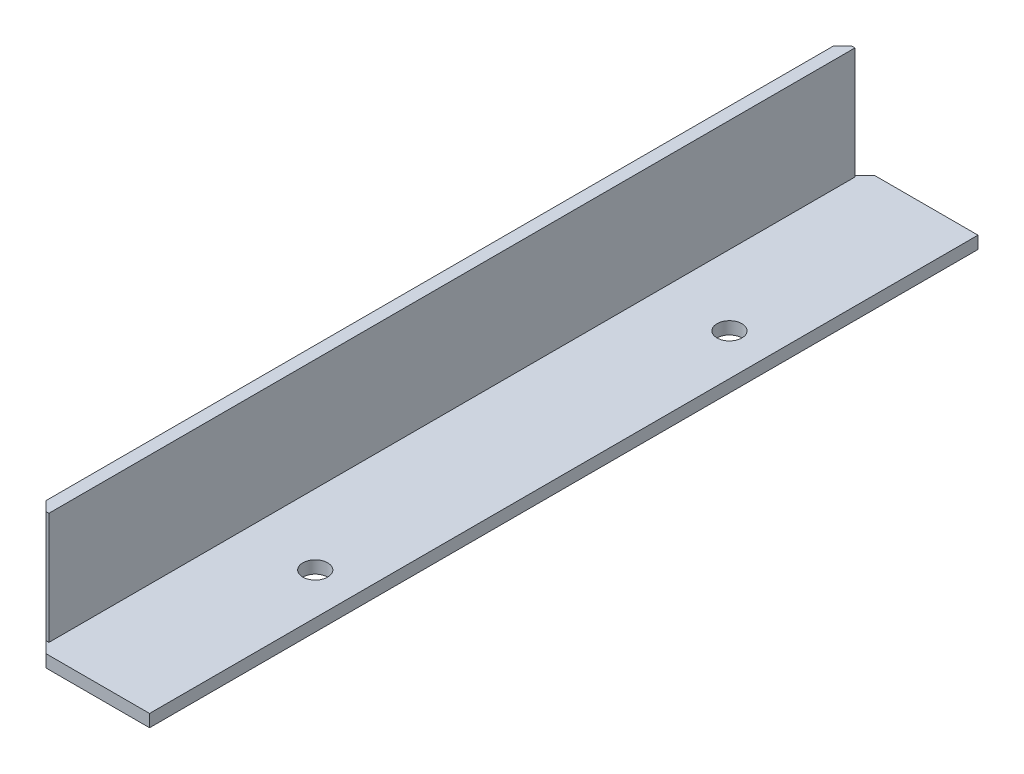
ISO-10303-21;
HEADER;
FILE_DESCRIPTION(('STEP AP214'),'2;1');
FILE_NAME('part.step','',(''),(''),'','','');
FILE_SCHEMA(('AUTOMOTIVE_DESIGN { 1 0 10303 214 1 1 1 1 }'));
ENDSEC;
DATA;
#1=APPLICATION_CONTEXT('core data for automotive mechanical design processes');
#2=APPLICATION_PROTOCOL_DEFINITION('international standard','automotive_design',2000,#1);
#3=PRODUCT_CONTEXT('',#1,'mechanical');
#4=PRODUCT('Part','Part','',(#3));
#5=PRODUCT_RELATED_PRODUCT_CATEGORY('part','',(#4));
#6=PRODUCT_DEFINITION_FORMATION('','',#4);
#7=PRODUCT_DEFINITION_CONTEXT('part definition',#1,'design');
#8=PRODUCT_DEFINITION('design','',#6,#7);
#9=PRODUCT_DEFINITION_SHAPE('','',#8);
#10=(LENGTH_UNIT() NAMED_UNIT(*) SI_UNIT(.MILLI.,.METRE.));
#11=(NAMED_UNIT(*) PLANE_ANGLE_UNIT() SI_UNIT($,.RADIAN.));
#12=(NAMED_UNIT(*) SI_UNIT($,.STERADIAN.) SOLID_ANGLE_UNIT());
#13=UNCERTAINTY_MEASURE_WITH_UNIT(LENGTH_MEASURE(1.E-05),#10,'distance_accuracy_value','');
#14=(GEOMETRIC_REPRESENTATION_CONTEXT(3) GLOBAL_UNCERTAINTY_ASSIGNED_CONTEXT((#13)) GLOBAL_UNIT_ASSIGNED_CONTEXT((#10,
#11,#12)) REPRESENTATION_CONTEXT('',''));
#15=CARTESIAN_POINT('',(0.,0.,0.));
#16=DIRECTION('',(0.,0.,1.));
#17=DIRECTION('',(1.,0.,0.));
#18=AXIS2_PLACEMENT_3D('',#15,#16,#17);
#19=CARTESIAN_POINT('',(0.,0.,100.));
#20=DIRECTION('',(1.,0.,0.));
#21=DIRECTION('',(0.,0.,-1.));
#22=AXIS2_PLACEMENT_3D('',#19,#20,#21);
#23=PLANE('',#22);
#24=DIRECTION('',(0.,0.,-1.));
#25=VECTOR('',#24,1.);
#26=CARTESIAN_POINT('',(0.,0.,100.));
#27=LINE('',#26,#25);
#28=CARTESIAN_POINT('',(0.,0.,97.5));
#29=VERTEX_POINT('',#28);
#30=CARTESIAN_POINT('',(0.,0.,2.50000000000006));
#31=VERTEX_POINT('',#30);
#32=EDGE_CURVE('E127',#29,#31,#27,.T.);
#33=ORIENTED_EDGE('',*,*,#32,.F.);
#34=DIRECTION('',(0.,1.,0.));
#35=VECTOR('',#34,1.);
#36=CARTESIAN_POINT('',(0.,0.,97.5));
#37=LINE('',#36,#35);
#38=CARTESIAN_POINT('',(0.,14.9999999999999,97.5));
#39=VERTEX_POINT('',#38);
#40=EDGE_CURVE('E169',#29,#39,#37,.T.);
#41=ORIENTED_EDGE('',*,*,#40,.T.);
#42=DIRECTION('',(0.,0.,-1.));
#43=VECTOR('',#42,1.);
#44=CARTESIAN_POINT('',(0.,14.9999999999999,100.));
#45=LINE('',#44,#43);
#46=CARTESIAN_POINT('',(0.,14.9999999999999,2.50000000000005));
#47=VERTEX_POINT('',#46);
#48=EDGE_CURVE('E135',#39,#47,#45,.T.);
#49=ORIENTED_EDGE('',*,*,#48,.T.);
#50=DIRECTION('',(0.,-1.,0.));
#51=VECTOR('',#50,1.);
#52=CARTESIAN_POINT('',(0.,0.,2.50000000000004));
#53=LINE('',#52,#51);
#54=EDGE_CURVE('E166',#47,#31,#53,.T.);
#55=ORIENTED_EDGE('',*,*,#54,.T.);
#56=EDGE_LOOP('',(#33,#41,#49,#55));
#57=FACE_BOUND('',#56,.T.);
#58=ADVANCED_FACE('F31',(#57),#23,.F.);
#59=CARTESIAN_POINT('',(1.5,0.,100.));
#60=DIRECTION('',(0.,1.,0.));
#61=DIRECTION('',(0.,0.,1.));
#62=AXIS2_PLACEMENT_3D('',#59,#60,#61);
#63=PLANE('',#62);
#64=CARTESIAN_POINT('',(10.,0.,25.));
#65=DIRECTION('',(0.,-1.,0.));
#66=DIRECTION('',(0.,0.,-1.));
#67=AXIS2_PLACEMENT_3D('',#64,#65,#66);
#68=CIRCLE('',#67,1.5);
#69=CARTESIAN_POINT('',(10.,0.,23.5));
#70=VERTEX_POINT('',#69);
#71=EDGE_CURVE('E160',#70,#70,#68,.T.);
#72=ORIENTED_EDGE('',*,*,#71,.F.);
#73=EDGE_LOOP('',(#72));
#74=FACE_BOUND('',#73,.T.);
#75=CARTESIAN_POINT('',(10.,0.,75.));
#76=DIRECTION('',(0.,-1.,0.));
#77=DIRECTION('',(0.,0.,-1.));
#78=AXIS2_PLACEMENT_3D('',#75,#76,#77);
#79=CIRCLE('',#78,1.5);
#80=CARTESIAN_POINT('',(10.,0.,73.5));
#81=VERTEX_POINT('',#80);
#82=EDGE_CURVE('E156',#81,#81,#79,.T.);
#83=ORIENTED_EDGE('',*,*,#82,.F.);
#84=EDGE_LOOP('',(#83));
#85=FACE_BOUND('',#84,.T.);
#86=DIRECTION('',(1.,0.,0.));
#87=VECTOR('',#86,1.);
#88=CARTESIAN_POINT('',(0.,0.,100.));
#89=LINE('',#88,#87);
#90=CARTESIAN_POINT('',(2.50000000000004,0.,100.));
#91=VERTEX_POINT('',#90);
#92=CARTESIAN_POINT('',(15.,0.,100.));
#93=VERTEX_POINT('',#92);
#94=EDGE_CURVE('E108',#91,#93,#89,.T.);
#95=ORIENTED_EDGE('',*,*,#94,.F.);
#96=DIRECTION('',(0.707106781186551,0.,0.707106781186544));
#97=VECTOR('',#96,1.);
#98=CARTESIAN_POINT('',(2.50000000000004,0.,100.));
#99=LINE('',#98,#97);
#100=EDGE_CURVE('E164',#91,#29,#99,.F.);
#101=ORIENTED_EDGE('',*,*,#100,.T.);
#102=ORIENTED_EDGE('',*,*,#32,.T.);
#103=DIRECTION('',(0.707106781186544,0.,-0.707106781186551));
#104=VECTOR('',#103,1.);
#105=CARTESIAN_POINT('',(0.,0.,2.50000000000004));
#106=LINE('',#105,#104);
#107=CARTESIAN_POINT('',(2.50000000000002,0.,0.));
#108=VERTEX_POINT('',#107);
#109=EDGE_CURVE('E162',#31,#108,#106,.T.);
#110=ORIENTED_EDGE('',*,*,#109,.T.);
#111=DIRECTION('',(1.,0.,0.));
#112=VECTOR('',#111,1.);
#113=CARTESIAN_POINT('',(1.5,0.,0.));
#114=LINE('',#113,#112);
#115=CARTESIAN_POINT('',(15.,0.,0.));
#116=VERTEX_POINT('',#115);
#117=EDGE_CURVE('E124',#108,#116,#114,.T.);
#118=ORIENTED_EDGE('',*,*,#117,.T.);
#119=DIRECTION('',(0.,0.,-1.));
#120=VECTOR('',#119,1.);
#121=CARTESIAN_POINT('',(15.,0.,100.));
#122=LINE('',#121,#120);
#123=EDGE_CURVE('E121',#93,#116,#122,.T.);
#124=ORIENTED_EDGE('',*,*,#123,.F.);
#125=EDGE_LOOP('',(#95,#101,#102,#110,#118,#124));
#126=FACE_BOUND('',#125,.T.);
#127=ADVANCED_FACE('F122',(#74,#85,#126),#63,.F.);
#128=CARTESIAN_POINT('',(15.,0.,100.));
#129=DIRECTION('',(-1.,0.,0.));
#130=DIRECTION('',(0.,0.,1.));
#131=AXIS2_PLACEMENT_3D('',#128,#129,#130);
#132=PLANE('',#131);
#133=DIRECTION('',(0.,1.,0.));
#134=VECTOR('',#133,1.);
#135=CARTESIAN_POINT('',(15.,0.,0.));
#136=LINE('',#135,#134);
#137=CARTESIAN_POINT('',(15.,1.5,0.));
#138=VERTEX_POINT('',#137);
#139=EDGE_CURVE('E140',#116,#138,#136,.T.);
#140=ORIENTED_EDGE('',*,*,#139,.T.);
#141=DIRECTION('',(0.,0.,-1.));
#142=VECTOR('',#141,1.);
#143=CARTESIAN_POINT('',(15.,1.5,100.));
#144=LINE('',#143,#142);
#145=CARTESIAN_POINT('',(15.,1.5,100.));
#146=VERTEX_POINT('',#145);
#147=EDGE_CURVE('E128',#146,#138,#144,.T.);
#148=ORIENTED_EDGE('',*,*,#147,.F.);
#149=DIRECTION('',(0.,1.,0.));
#150=VECTOR('',#149,1.);
#151=CARTESIAN_POINT('',(15.,0.,100.));
#152=LINE('',#151,#150);
#153=EDGE_CURVE('E113',#93,#146,#152,.T.);
#154=ORIENTED_EDGE('',*,*,#153,.F.);
#155=ORIENTED_EDGE('',*,*,#123,.T.);
#156=EDGE_LOOP('',(#140,#148,#154,#155));
#157=FACE_BOUND('',#156,.T.);
#158=ADVANCED_FACE('F130',(#157),#132,.F.);
#159=CARTESIAN_POINT('',(1.5,1.5,100.));
#160=DIRECTION('',(0.,-1.,0.));
#161=DIRECTION('',(0.,0.,-1.));
#162=AXIS2_PLACEMENT_3D('',#159,#160,#161);
#163=PLANE('',#162);
#164=CARTESIAN_POINT('',(10.,1.5,25.));
#165=DIRECTION('',(0.,-1.,0.));
#166=DIRECTION('',(0.,0.,-1.));
#167=AXIS2_PLACEMENT_3D('',#164,#165,#166);
#168=CIRCLE('',#167,1.5);
#169=CARTESIAN_POINT('',(10.,1.5,23.5));
#170=VERTEX_POINT('',#169);
#171=EDGE_CURVE('E157',#170,#170,#168,.T.);
#172=ORIENTED_EDGE('',*,*,#171,.T.);
#173=EDGE_LOOP('',(#172));
#174=FACE_BOUND('',#173,.T.);
#175=CARTESIAN_POINT('',(10.,1.5,75.));
#176=DIRECTION('',(0.,-1.,0.));
#177=DIRECTION('',(0.,0.,-1.));
#178=AXIS2_PLACEMENT_3D('',#175,#176,#177);
#179=CIRCLE('',#178,1.5);
#180=CARTESIAN_POINT('',(10.,1.5,73.5));
#181=VERTEX_POINT('',#180);
#182=EDGE_CURVE('E141',#181,#181,#179,.T.);
#183=ORIENTED_EDGE('',*,*,#182,.T.);
#184=EDGE_LOOP('',(#183));
#185=FACE_BOUND('',#184,.T.);
#186=DIRECTION('',(0.,0.,-1.));
#187=VECTOR('',#186,1.);
#188=CARTESIAN_POINT('',(1.5,1.5,100.));
#189=LINE('',#188,#187);
#190=CARTESIAN_POINT('',(1.5,1.5,98.6464466094067));
#191=VERTEX_POINT('',#190);
#192=CARTESIAN_POINT('',(1.5,1.5,1.35355339059333));
#193=VERTEX_POINT('',#192);
#194=EDGE_CURVE('E148',#191,#193,#189,.T.);
#195=ORIENTED_EDGE('',*,*,#194,.F.);
#196=DIRECTION('',(1.,0.,0.));
#197=VECTOR('',#196,1.);
#198=CARTESIAN_POINT('',(1.50000000000005,1.5,98.6464466094067));
#199=LINE('',#198,#197);
#200=CARTESIAN_POINT('',(1.1464466094067,1.5,98.6464466094067));
#201=VERTEX_POINT('',#200);
#202=EDGE_CURVE('E39',#191,#201,#199,.F.);
#203=ORIENTED_EDGE('',*,*,#202,.T.);
#204=DIRECTION('',(-0.707106781186551,0.,-0.707106781186544));
#205=VECTOR('',#204,1.);
#206=CARTESIAN_POINT('',(2.50000000000004,1.5,100.));
#207=LINE('',#206,#205);
#208=CARTESIAN_POINT('',(2.50000000000004,1.5,100.));
#209=VERTEX_POINT('',#208);
#210=EDGE_CURVE('E177',#201,#209,#207,.F.);
#211=ORIENTED_EDGE('',*,*,#210,.T.);
#212=DIRECTION('',(-1.,0.,0.));
#213=VECTOR('',#212,1.);
#214=CARTESIAN_POINT('',(1.5,1.5,100.));
#215=LINE('',#214,#213);
#216=EDGE_CURVE('E133',#146,#209,#215,.T.);
#217=ORIENTED_EDGE('',*,*,#216,.F.);
#218=ORIENTED_EDGE('',*,*,#147,.T.);
#219=DIRECTION('',(-1.,0.,0.));
#220=VECTOR('',#219,1.);
#221=CARTESIAN_POINT('',(1.5,1.5,0.));
#222=LINE('',#221,#220);
#223=CARTESIAN_POINT('',(2.50000000000002,1.5,0.));
#224=VERTEX_POINT('',#223);
#225=EDGE_CURVE('E118',#138,#224,#222,.T.);
#226=ORIENTED_EDGE('',*,*,#225,.T.);
#227=DIRECTION('',(-0.707106781186544,0.,0.707106781186551));
#228=VECTOR('',#227,1.);
#229=CARTESIAN_POINT('',(0.,1.5,2.50000000000004));
#230=LINE('',#229,#228);
#231=CARTESIAN_POINT('',(1.14644660940671,1.5,1.35355339059332));
#232=VERTEX_POINT('',#231);
#233=EDGE_CURVE('E45',#224,#232,#230,.T.);
#234=ORIENTED_EDGE('',*,*,#233,.T.);
#235=DIRECTION('',(1.,0.,0.));
#236=VECTOR('',#235,1.);
#237=CARTESIAN_POINT('',(1.50000000000296,1.5,1.35355339059333));
#238=LINE('',#237,#236);
#239=EDGE_CURVE('E11',#232,#193,#238,.T.);
#240=ORIENTED_EDGE('',*,*,#239,.T.);
#241=EDGE_LOOP('',(#195,#203,#211,#217,#218,#226,#234,#240));
#242=FACE_BOUND('',#241,.T.);
#243=ADVANCED_FACE('F196',(#174,#185,#242),#163,.F.);
#244=CARTESIAN_POINT('',(1.5,1.5,100.));
#245=DIRECTION('',(-1.,0.,0.));
#246=DIRECTION('',(0.,0.,1.));
#247=AXIS2_PLACEMENT_3D('',#244,#245,#246);
#248=PLANE('',#247);
#249=DIRECTION('',(0.,0.,-1.));
#250=VECTOR('',#249,1.);
#251=CARTESIAN_POINT('',(1.5,15.,100.));
#252=LINE('',#251,#250);
#253=CARTESIAN_POINT('',(1.5,15.,98.6464466094067));
#254=VERTEX_POINT('',#253);
#255=CARTESIAN_POINT('',(1.5,15.,1.35355339059333));
#256=VERTEX_POINT('',#255);
#257=EDGE_CURVE('E146',#254,#256,#252,.T.);
#258=ORIENTED_EDGE('',*,*,#257,.F.);
#259=DIRECTION('',(0.,-1.,0.));
#260=VECTOR('',#259,1.);
#261=CARTESIAN_POINT('',(1.5,1.5,98.6464466094067));
#262=LINE('',#261,#260);
#263=EDGE_CURVE('E184',#254,#191,#262,.T.);
#264=ORIENTED_EDGE('',*,*,#263,.T.);
#265=ORIENTED_EDGE('',*,*,#194,.T.);
#266=DIRECTION('',(0.,1.,0.));
#267=VECTOR('',#266,1.);
#268=CARTESIAN_POINT('',(1.5,15.,1.35355339059333));
#269=LINE('',#268,#267);
#270=EDGE_CURVE('E181',#193,#256,#269,.T.);
#271=ORIENTED_EDGE('',*,*,#270,.T.);
#272=EDGE_LOOP('',(#258,#264,#265,#271));
#273=FACE_BOUND('',#272,.T.);
#274=ADVANCED_FACE('F222',(#273),#248,.F.);
#275=CARTESIAN_POINT('',(0.,14.9999999999999,100.));
#276=DIRECTION('',(0.,-1.,0.));
#277=DIRECTION('',(1.,0.,0.));
#278=AXIS2_PLACEMENT_3D('',#275,#276,#277);
#279=PLANE('',#278);
#280=DIRECTION('',(-0.707106781186551,0.,-0.707106781186544));
#281=VECTOR('',#280,1.);
#282=CARTESIAN_POINT('',(2.50000000000004,15.0000000000001,100.));
#283=LINE('',#282,#281);
#284=CARTESIAN_POINT('',(1.1464466094067,15.,98.6464466094067));
#285=VERTEX_POINT('',#284);
#286=EDGE_CURVE('E173',#39,#285,#283,.F.);
#287=ORIENTED_EDGE('',*,*,#286,.T.);
#288=DIRECTION('',(-1.,0.,0.));
#289=VECTOR('',#288,1.);
#290=CARTESIAN_POINT('',(1.49999999999913,15.,98.6464466094067));
#291=LINE('',#290,#289);
#292=EDGE_CURVE('E190',#285,#254,#291,.F.);
#293=ORIENTED_EDGE('',*,*,#292,.T.);
#294=ORIENTED_EDGE('',*,*,#257,.T.);
#295=DIRECTION('',(-1.,0.,0.));
#296=VECTOR('',#295,1.);
#297=CARTESIAN_POINT('',(1.49999999999913,15.,1.35355339059333));
#298=LINE('',#297,#296);
#299=CARTESIAN_POINT('',(1.14644660940671,15.,1.35355339059332));
#300=VERTEX_POINT('',#299);
#301=EDGE_CURVE('E53',#256,#300,#298,.T.);
#302=ORIENTED_EDGE('',*,*,#301,.T.);
#303=DIRECTION('',(-0.707106781186544,0.,0.707106781186551));
#304=VECTOR('',#303,1.);
#305=CARTESIAN_POINT('',(-4.85722573273498E-13,14.9999999999999,2.50000000000053));
#306=LINE('',#305,#304);
#307=EDGE_CURVE('E171',#300,#47,#306,.T.);
#308=ORIENTED_EDGE('',*,*,#307,.T.);
#309=ORIENTED_EDGE('',*,*,#48,.F.);
#310=EDGE_LOOP('',(#287,#293,#294,#302,#308,#309));
#311=FACE_BOUND('',#310,.T.);
#312=ADVANCED_FACE('F206',(#311),#279,.F.);
#313=CARTESIAN_POINT('',(0.,14.9999999999999,100.));
#314=DIRECTION('',(0.,0.,-1.));
#315=DIRECTION('',(-1.,0.,0.));
#316=AXIS2_PLACEMENT_3D('',#313,#314,#315);
#317=PLANE('',#316);
#318=ORIENTED_EDGE('',*,*,#216,.T.);
#319=DIRECTION('',(0.,-1.,0.));
#320=VECTOR('',#319,1.);
#321=CARTESIAN_POINT('',(2.50000000000004,14.9999999999999,100.));
#322=LINE('',#321,#320);
#323=EDGE_CURVE('E116',#209,#91,#322,.T.);
#324=ORIENTED_EDGE('',*,*,#323,.T.);
#325=ORIENTED_EDGE('',*,*,#94,.T.);
#326=ORIENTED_EDGE('',*,*,#153,.T.);
#327=EDGE_LOOP('',(#318,#324,#325,#326));
#328=FACE_BOUND('',#327,.T.);
#329=ADVANCED_FACE('F111',(#328),#317,.F.);
#330=CARTESIAN_POINT('',(0.,14.9999999999999,0.));
#331=DIRECTION('',(0.,0.,-1.));
#332=DIRECTION('',(-1.,0.,0.));
#333=AXIS2_PLACEMENT_3D('',#330,#331,#332);
#334=PLANE('',#333);
#335=ORIENTED_EDGE('',*,*,#117,.F.);
#336=DIRECTION('',(0.,1.,0.));
#337=VECTOR('',#336,1.);
#338=CARTESIAN_POINT('',(2.50000000000002,14.9999999999999,0.));
#339=LINE('',#338,#337);
#340=EDGE_CURVE('E179',#108,#224,#339,.T.);
#341=ORIENTED_EDGE('',*,*,#340,.T.);
#342=ORIENTED_EDGE('',*,*,#225,.F.);
#343=ORIENTED_EDGE('',*,*,#139,.F.);
#344=EDGE_LOOP('',(#335,#341,#342,#343));
#345=FACE_BOUND('',#344,.T.);
#346=ADVANCED_FACE('F216',(#345),#334,.T.);
#347=CARTESIAN_POINT('',(10.,100.,75.));
#348=DIRECTION('',(0.,-1.,0.));
#349=DIRECTION('',(0.,0.,-1.));
#350=AXIS2_PLACEMENT_3D('',#347,#348,#349);
#351=CYLINDRICAL_SURFACE('',#350,1.5);
#352=ORIENTED_EDGE('',*,*,#82,.T.);
#353=EDGE_LOOP('',(#352));
#354=FACE_BOUND('',#353,.T.);
#355=ORIENTED_EDGE('',*,*,#182,.F.);
#356=EDGE_LOOP('',(#355));
#357=FACE_BOUND('',#356,.T.);
#358=ADVANCED_FACE('F298',(#354,#357),#351,.F.);
#359=CARTESIAN_POINT('',(10.,100.,25.));
#360=DIRECTION('',(0.,-1.,0.));
#361=DIRECTION('',(0.,0.,-1.));
#362=AXIS2_PLACEMENT_3D('',#359,#360,#361);
#363=CYLINDRICAL_SURFACE('',#362,1.5);
#364=ORIENTED_EDGE('',*,*,#71,.T.);
#365=EDGE_LOOP('',(#364));
#366=FACE_BOUND('',#365,.T.);
#367=ORIENTED_EDGE('',*,*,#171,.F.);
#368=EDGE_LOOP('',(#367));
#369=FACE_BOUND('',#368,.T.);
#370=ADVANCED_FACE('F243',(#366,#369),#363,.F.);
#371=CARTESIAN_POINT('',(2.50000000000004,14.9999999999999,100.));
#372=DIRECTION('',(0.707106781186544,0.,-0.707106781186551));
#373=DIRECTION('',(-0.707106781186551,0.,-0.707106781186544));
#374=AXIS2_PLACEMENT_3D('',#371,#372,#373);
#375=PLANE('',#374);
#376=ORIENTED_EDGE('',*,*,#210,.F.);
#377=DIRECTION('',(0.,-1.,0.));
#378=VECTOR('',#377,1.);
#379=CARTESIAN_POINT('',(1.1464466094067,15.,98.6464466094067));
#380=LINE('',#379,#378);
#381=EDGE_CURVE('E187',#201,#285,#380,.F.);
#382=ORIENTED_EDGE('',*,*,#381,.T.);
#383=ORIENTED_EDGE('',*,*,#286,.F.);
#384=ORIENTED_EDGE('',*,*,#40,.F.);
#385=ORIENTED_EDGE('',*,*,#100,.F.);
#386=ORIENTED_EDGE('',*,*,#323,.F.);
#387=EDGE_LOOP('',(#376,#382,#383,#384,#385,#386));
#388=FACE_BOUND('',#387,.T.);
#389=ADVANCED_FACE('F203',(#388),#375,.F.);
#390=CARTESIAN_POINT('',(0.,0.,2.50000000000004));
#391=DIRECTION('',(-0.707106781186551,0.,-0.707106781186544));
#392=DIRECTION('',(-0.707106781186544,0.,0.707106781186551));
#393=AXIS2_PLACEMENT_3D('',#390,#391,#392);
#394=PLANE('',#393);
#395=ORIENTED_EDGE('',*,*,#307,.F.);
#396=DIRECTION('',(0.,-1.,0.));
#397=VECTOR('',#396,1.);
#398=CARTESIAN_POINT('',(1.14644660940671,1.5,1.35355339059332));
#399=LINE('',#398,#397);
#400=EDGE_CURVE('E192',#300,#232,#399,.T.);
#401=ORIENTED_EDGE('',*,*,#400,.T.);
#402=ORIENTED_EDGE('',*,*,#233,.F.);
#403=ORIENTED_EDGE('',*,*,#340,.F.);
#404=ORIENTED_EDGE('',*,*,#109,.F.);
#405=ORIENTED_EDGE('',*,*,#54,.F.);
#406=EDGE_LOOP('',(#395,#401,#402,#403,#404,#405));
#407=FACE_BOUND('',#406,.T.);
#408=ADVANCED_FACE('F212',(#407),#394,.T.);
#409=CARTESIAN_POINT('',(1.5,1.5,98.6464466094067));
#410=DIRECTION('',(0.,0.,-1.));
#411=DIRECTION('',(-1.,0.,0.));
#412=AXIS2_PLACEMENT_3D('',#409,#410,#411);
#413=PLANE('',#412);
#414=ORIENTED_EDGE('',*,*,#292,.F.);
#415=ORIENTED_EDGE('',*,*,#381,.F.);
#416=ORIENTED_EDGE('',*,*,#202,.F.);
#417=ORIENTED_EDGE('',*,*,#263,.F.);
#418=EDGE_LOOP('',(#414,#415,#416,#417));
#419=FACE_BOUND('',#418,.T.);
#420=ADVANCED_FACE('F200',(#419),#413,.F.);
#421=CARTESIAN_POINT('',(1.5,1.5,1.35355339059333));
#422=DIRECTION('',(0.,0.,-1.));
#423=DIRECTION('',(-1.,0.,0.));
#424=AXIS2_PLACEMENT_3D('',#421,#422,#423);
#425=PLANE('',#424);
#426=ORIENTED_EDGE('',*,*,#239,.F.);
#427=ORIENTED_EDGE('',*,*,#400,.F.);
#428=ORIENTED_EDGE('',*,*,#301,.F.);
#429=ORIENTED_EDGE('',*,*,#270,.F.);
#430=EDGE_LOOP('',(#426,#427,#428,#429));
#431=FACE_BOUND('',#430,.T.);
#432=ADVANCED_FACE('F33',(#431),#425,.T.);
#433=CLOSED_SHELL('',(#58,#127,#158,#243,#274,#312,#329,#346,#358,#370,#389,#408,#420,#432));
#434=MANIFOLD_SOLID_BREP('B2',#433);
#435=ADVANCED_BREP_SHAPE_REPRESENTATION('',(#18,#434),#14);
#436=SHAPE_DEFINITION_REPRESENTATION(#9,#435);
ENDSEC;
END-ISO-10303-21;
